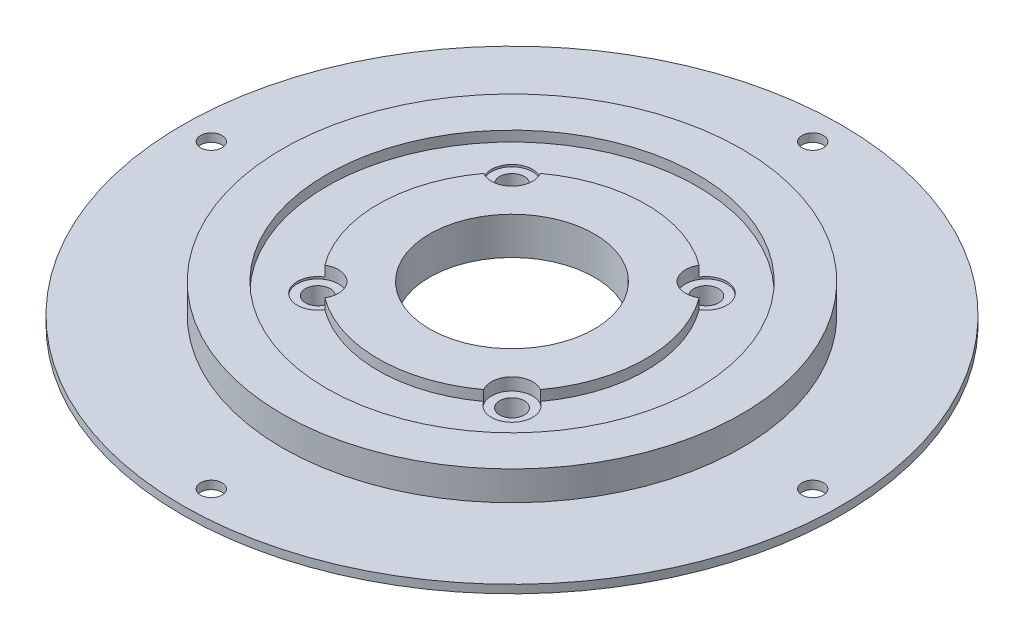
ISO-10303-21;
HEADER;
FILE_DESCRIPTION(('STEP AP214'),'2;1');
FILE_NAME('part.step','',(''),(''),'','','');
FILE_SCHEMA(('AUTOMOTIVE_DESIGN { 1 0 10303 214 1 1 1 1 }'));
ENDSEC;
DATA;
#1=APPLICATION_CONTEXT('core data for automotive mechanical design processes');
#2=APPLICATION_PROTOCOL_DEFINITION('international standard','automotive_design',2000,#1);
#3=PRODUCT_CONTEXT('',#1,'mechanical');
#4=PRODUCT('Part','Part','',(#3));
#5=PRODUCT_RELATED_PRODUCT_CATEGORY('part','',(#4));
#6=PRODUCT_DEFINITION_FORMATION('','',#4);
#7=PRODUCT_DEFINITION_CONTEXT('part definition',#1,'design');
#8=PRODUCT_DEFINITION('design','',#6,#7);
#9=PRODUCT_DEFINITION_SHAPE('','',#8);
#10=(LENGTH_UNIT() NAMED_UNIT(*) SI_UNIT(.MILLI.,.METRE.));
#11=(NAMED_UNIT(*) PLANE_ANGLE_UNIT() SI_UNIT($,.RADIAN.));
#12=(NAMED_UNIT(*) SI_UNIT($,.STERADIAN.) SOLID_ANGLE_UNIT());
#13=UNCERTAINTY_MEASURE_WITH_UNIT(LENGTH_MEASURE(1.E-05),#10,'distance_accuracy_value','');
#14=(GEOMETRIC_REPRESENTATION_CONTEXT(3) GLOBAL_UNCERTAINTY_ASSIGNED_CONTEXT((#13)) GLOBAL_UNIT_ASSIGNED_CONTEXT((#10,
#11,#12)) REPRESENTATION_CONTEXT('',''));
#15=CARTESIAN_POINT('',(0.,0.,0.));
#16=DIRECTION('',(0.,0.,1.));
#17=DIRECTION('',(1.,0.,0.));
#18=AXIS2_PLACEMENT_3D('',#15,#16,#17);
#19=CARTESIAN_POINT('',(-23.57,2.,23.57));
#20=DIRECTION('',(0.,-1.,0.));
#21=DIRECTION('',(0.,0.,-1.));
#22=AXIS2_PLACEMENT_3D('',#19,#20,#21);
#23=CYLINDRICAL_SURFACE('',#22,3.);
#24=CARTESIAN_POINT('',(-23.57,0.,23.57));
#25=DIRECTION('',(0.,-1.,0.));
#26=DIRECTION('',(0.,0.,-1.));
#27=AXIS2_PLACEMENT_3D('',#24,#25,#26);
#28=CIRCLE('',#27,3.);
#29=CARTESIAN_POINT('',(-23.57,0.,20.57));
#30=VERTEX_POINT('',#29);
#31=EDGE_CURVE('E389',#30,#30,#28,.T.);
#32=ORIENTED_EDGE('',*,*,#31,.T.);
#33=EDGE_LOOP('',(#32));
#34=FACE_BOUND('',#33,.T.);
#35=CARTESIAN_POINT('',(-23.57,6.1,23.57));
#36=DIRECTION('',(0.,1.,0.));
#37=DIRECTION('',(0.,0.,1.));
#38=AXIS2_PLACEMENT_3D('',#35,#36,#37);
#39=CIRCLE('',#38,3.);
#40=CARTESIAN_POINT('',(-23.57,6.1,26.57));
#41=VERTEX_POINT('',#40);
#42=EDGE_CURVE('E77',#41,#41,#39,.F.);
#43=ORIENTED_EDGE('',*,*,#42,.F.);
#44=EDGE_LOOP('',(#43));
#45=FACE_BOUND('',#44,.T.);
#46=ADVANCED_FACE('F73',(#34,#45),#23,.F.);
#47=CARTESIAN_POINT('',(23.57,2.,23.57));
#48=DIRECTION('',(0.,-1.,0.));
#49=DIRECTION('',(0.,0.,-1.));
#50=AXIS2_PLACEMENT_3D('',#47,#48,#49);
#51=CYLINDRICAL_SURFACE('',#50,3.);
#52=CARTESIAN_POINT('',(23.57,0.,23.57));
#53=DIRECTION('',(0.,-1.,0.));
#54=DIRECTION('',(0.,0.,-1.));
#55=AXIS2_PLACEMENT_3D('',#52,#53,#54);
#56=CIRCLE('',#55,3.);
#57=CARTESIAN_POINT('',(23.57,0.,20.57));
#58=VERTEX_POINT('',#57);
#59=EDGE_CURVE('E385',#58,#58,#56,.T.);
#60=ORIENTED_EDGE('',*,*,#59,.T.);
#61=EDGE_LOOP('',(#60));
#62=FACE_BOUND('',#61,.T.);
#63=CARTESIAN_POINT('',(23.57,6.1,23.57));
#64=DIRECTION('',(0.,1.,0.));
#65=DIRECTION('',(0.,0.,1.));
#66=AXIS2_PLACEMENT_3D('',#63,#64,#65);
#67=CIRCLE('',#66,3.);
#68=CARTESIAN_POINT('',(23.57,6.1,26.57));
#69=VERTEX_POINT('',#68);
#70=EDGE_CURVE('E211',#69,#69,#67,.F.);
#71=ORIENTED_EDGE('',*,*,#70,.F.);
#72=EDGE_LOOP('',(#71));
#73=FACE_BOUND('',#72,.T.);
#74=ADVANCED_FACE('F223',(#62,#73),#51,.F.);
#75=CARTESIAN_POINT('',(23.57,2.,-23.57));
#76=DIRECTION('',(0.,-1.,0.));
#77=DIRECTION('',(0.,0.,-1.));
#78=AXIS2_PLACEMENT_3D('',#75,#76,#77);
#79=CYLINDRICAL_SURFACE('',#78,3.);
#80=CARTESIAN_POINT('',(23.57,0.,-23.57));
#81=DIRECTION('',(0.,-1.,0.));
#82=DIRECTION('',(0.,0.,-1.));
#83=AXIS2_PLACEMENT_3D('',#80,#81,#82);
#84=CIRCLE('',#83,3.);
#85=CARTESIAN_POINT('',(23.57,0.,-26.57));
#86=VERTEX_POINT('',#85);
#87=EDGE_CURVE('E309',#86,#86,#84,.T.);
#88=ORIENTED_EDGE('',*,*,#87,.T.);
#89=EDGE_LOOP('',(#88));
#90=FACE_BOUND('',#89,.T.);
#91=CARTESIAN_POINT('',(23.57,6.1,-23.57));
#92=DIRECTION('',(0.,1.,0.));
#93=DIRECTION('',(0.,0.,1.));
#94=AXIS2_PLACEMENT_3D('',#91,#92,#93);
#95=CIRCLE('',#94,3.);
#96=CARTESIAN_POINT('',(23.57,6.1,-20.57));
#97=VERTEX_POINT('',#96);
#98=EDGE_CURVE('E207',#97,#97,#95,.F.);
#99=ORIENTED_EDGE('',*,*,#98,.F.);
#100=EDGE_LOOP('',(#99));
#101=FACE_BOUND('',#100,.T.);
#102=ADVANCED_FACE('F230',(#90,#101),#79,.F.);
#103=CARTESIAN_POINT('',(-23.57,2.,-23.57));
#104=DIRECTION('',(0.,-1.,0.));
#105=DIRECTION('',(0.,0.,-1.));
#106=AXIS2_PLACEMENT_3D('',#103,#104,#105);
#107=CYLINDRICAL_SURFACE('',#106,3.);
#108=CARTESIAN_POINT('',(-23.57,0.,-23.57));
#109=DIRECTION('',(0.,-1.,0.));
#110=DIRECTION('',(0.,0.,-1.));
#111=AXIS2_PLACEMENT_3D('',#108,#109,#110);
#112=CIRCLE('',#111,3.);
#113=CARTESIAN_POINT('',(-23.57,0.,-26.57));
#114=VERTEX_POINT('',#113);
#115=EDGE_CURVE('E184',#114,#114,#112,.T.);
#116=ORIENTED_EDGE('',*,*,#115,.T.);
#117=EDGE_LOOP('',(#116));
#118=FACE_BOUND('',#117,.T.);
#119=CARTESIAN_POINT('',(-23.57,6.1,-23.57));
#120=DIRECTION('',(0.,1.,0.));
#121=DIRECTION('',(0.,0.,1.));
#122=AXIS2_PLACEMENT_3D('',#119,#120,#121);
#123=CIRCLE('',#122,3.);
#124=CARTESIAN_POINT('',(-23.57,6.1,-20.57));
#125=VERTEX_POINT('',#124);
#126=EDGE_CURVE('E203',#125,#125,#123,.F.);
#127=ORIENTED_EDGE('',*,*,#126,.F.);
#128=EDGE_LOOP('',(#127));
#129=FACE_BOUND('',#128,.T.);
#130=ADVANCED_FACE('F236',(#118,#129),#107,.F.);
#131=CARTESIAN_POINT('',(0.,4.5,0.));
#132=DIRECTION('',(0.,-1.,0.));
#133=DIRECTION('',(0.,0.,-1.));
#134=AXIS2_PLACEMENT_3D('',#131,#132,#133);
#135=CYLINDRICAL_SURFACE('',#134,32.5);
#136=DIRECTION('',(0.,-1.,0.));
#137=VECTOR('',#136,1.);
#138=CARTESIAN_POINT('',(26.1557810098976,7.6,19.2905448280311));
#139=LINE('',#138,#137);
#140=CARTESIAN_POINT('',(26.1557810098976,6.6,19.2905448280311));
#141=VERTEX_POINT('',#140);
#142=CARTESIAN_POINT('',(26.1557810098976,9.1,19.2905448280311));
#143=VERTEX_POINT('',#142);
#144=EDGE_CURVE('E351',#141,#143,#139,.F.);
#145=ORIENTED_EDGE('',*,*,#144,.F.);
#146=CARTESIAN_POINT('',(0.,6.6,0.));
#147=DIRECTION('',(0.,1.,0.));
#148=DIRECTION('',(0.,0.,1.));
#149=AXIS2_PLACEMENT_3D('',#146,#147,#148);
#150=CIRCLE('',#149,32.5);
#151=CARTESIAN_POINT('',(26.1557810098954,6.6,-19.2905448280341));
#152=VERTEX_POINT('',#151);
#153=EDGE_CURVE('E188',#141,#152,#150,.T.);
#154=ORIENTED_EDGE('',*,*,#153,.T.);
#155=DIRECTION('',(0.,-1.,0.));
#156=VECTOR('',#155,1.);
#157=CARTESIAN_POINT('',(26.1557810098954,7.6,-19.2905448280341));
#158=LINE('',#157,#156);
#159=CARTESIAN_POINT('',(26.1557810098954,9.1,-19.2905448280341));
#160=VERTEX_POINT('',#159);
#161=EDGE_CURVE('E363',#160,#152,#158,.T.);
#162=ORIENTED_EDGE('',*,*,#161,.F.);
#163=CARTESIAN_POINT('',(0.,9.1,0.));
#164=DIRECTION('',(0.,1.,0.));
#165=DIRECTION('',(0.,0.,1.));
#166=AXIS2_PLACEMENT_3D('',#163,#164,#165);
#167=CIRCLE('',#166,32.5);
#168=EDGE_CURVE('E165',#143,#160,#167,.T.);
#169=ORIENTED_EDGE('',*,*,#168,.F.);
#170=EDGE_LOOP('',(#145,#154,#162,#169));
#171=FACE_BOUND('',#170,.T.);
#172=ADVANCED_FACE('F284',(#171),#135,.T.);
#173=DIRECTION('',(0.,-1.,0.));
#174=VECTOR('',#173,1.);
#175=CARTESIAN_POINT('',(19.2905448280326,7.6,-26.1557810098965));
#176=LINE('',#175,#174);
#177=CARTESIAN_POINT('',(19.2905448280326,6.6,-26.1557810098965));
#178=VERTEX_POINT('',#177);
#179=CARTESIAN_POINT('',(19.2905448280326,9.1,-26.1557810098965));
#180=VERTEX_POINT('',#179);
#181=EDGE_CURVE('E158',#178,#180,#176,.F.);
#182=ORIENTED_EDGE('',*,*,#181,.F.);
#183=CARTESIAN_POINT('',(0.,6.6,0.));
#184=DIRECTION('',(0.,1.,0.));
#185=DIRECTION('',(0.,0.,1.));
#186=AXIS2_PLACEMENT_3D('',#183,#184,#185);
#187=CIRCLE('',#186,32.5);
#188=CARTESIAN_POINT('',(-19.2905448280342,6.6,-26.1557810098954));
#189=VERTEX_POINT('',#188);
#190=EDGE_CURVE('E156',#178,#189,#187,.T.);
#191=ORIENTED_EDGE('',*,*,#190,.T.);
#192=DIRECTION('',(0.,-1.,0.));
#193=VECTOR('',#192,1.);
#194=CARTESIAN_POINT('',(-19.2905448280342,7.6,-26.1557810098953));
#195=LINE('',#194,#193);
#196=CARTESIAN_POINT('',(-19.2905448280342,9.1,-26.1557810098953));
#197=VERTEX_POINT('',#196);
#198=EDGE_CURVE('E140',#197,#189,#195,.T.);
#199=ORIENTED_EDGE('',*,*,#198,.F.);
#200=CARTESIAN_POINT('',(0.,9.1,0.));
#201=DIRECTION('',(0.,1.,0.));
#202=DIRECTION('',(0.,0.,1.));
#203=AXIS2_PLACEMENT_3D('',#200,#201,#202);
#204=CIRCLE('',#203,32.5);
#205=EDGE_CURVE('E154',#180,#197,#204,.T.);
#206=ORIENTED_EDGE('',*,*,#205,.F.);
#207=EDGE_LOOP('',(#182,#191,#199,#206));
#208=FACE_BOUND('',#207,.T.);
#209=ADVANCED_FACE('F153',(#208),#135,.T.);
#210=DIRECTION('',(0.,-1.,0.));
#211=VECTOR('',#210,1.);
#212=CARTESIAN_POINT('',(-26.1557810098955,7.6,19.290544828034));
#213=LINE('',#212,#211);
#214=CARTESIAN_POINT('',(-26.1557810098955,9.1,19.290544828034));
#215=VERTEX_POINT('',#214);
#216=CARTESIAN_POINT('',(-26.1557810098955,6.6,19.290544828034));
#217=VERTEX_POINT('',#216);
#218=EDGE_CURVE('E208',#215,#217,#213,.T.);
#219=ORIENTED_EDGE('',*,*,#218,.F.);
#220=CARTESIAN_POINT('',(0.,9.1,0.));
#221=DIRECTION('',(0.,1.,0.));
#222=DIRECTION('',(0.,0.,1.));
#223=AXIS2_PLACEMENT_3D('',#220,#221,#222);
#224=CIRCLE('',#223,32.5);
#225=CARTESIAN_POINT('',(-26.1557810098954,9.1,-19.2905448280342));
#226=VERTEX_POINT('',#225);
#227=EDGE_CURVE('E164',#226,#215,#224,.T.);
#228=ORIENTED_EDGE('',*,*,#227,.F.);
#229=DIRECTION('',(0.,-1.,0.));
#230=VECTOR('',#229,1.);
#231=CARTESIAN_POINT('',(-26.1557810098953,7.6,-19.2905448280342));
#232=LINE('',#231,#230);
#233=CARTESIAN_POINT('',(-26.1557810098954,6.6,-19.2905448280342));
#234=VERTEX_POINT('',#233);
#235=EDGE_CURVE('E99',#234,#226,#232,.F.);
#236=ORIENTED_EDGE('',*,*,#235,.F.);
#237=CARTESIAN_POINT('',(0.,6.6,0.));
#238=DIRECTION('',(0.,1.,0.));
#239=DIRECTION('',(0.,0.,1.));
#240=AXIS2_PLACEMENT_3D('',#237,#238,#239);
#241=CIRCLE('',#240,32.5);
#242=EDGE_CURVE('E187',#234,#217,#241,.T.);
#243=ORIENTED_EDGE('',*,*,#242,.T.);
#244=EDGE_LOOP('',(#219,#228,#236,#243));
#245=FACE_BOUND('',#244,.T.);
#246=ADVANCED_FACE('F281',(#245),#135,.T.);
#247=DIRECTION('',(0.,-1.,0.));
#248=VECTOR('',#247,1.);
#249=CARTESIAN_POINT('',(-19.2905448280326,7.6,26.1557810098966));
#250=LINE('',#249,#248);
#251=CARTESIAN_POINT('',(-19.2905448280326,6.6,26.1557810098966));
#252=VERTEX_POINT('',#251);
#253=CARTESIAN_POINT('',(-19.2905448280325,9.1,26.1557810098966));
#254=VERTEX_POINT('',#253);
#255=EDGE_CURVE('E91',#252,#254,#250,.F.);
#256=ORIENTED_EDGE('',*,*,#255,.F.);
#257=CARTESIAN_POINT('',(0.,6.6,0.));
#258=DIRECTION('',(0.,1.,0.));
#259=DIRECTION('',(0.,0.,1.));
#260=AXIS2_PLACEMENT_3D('',#257,#258,#259);
#261=CIRCLE('',#260,32.5);
#262=CARTESIAN_POINT('',(19.2905448280341,6.6,26.1557810098955));
#263=VERTEX_POINT('',#262);
#264=EDGE_CURVE('E192',#252,#263,#261,.T.);
#265=ORIENTED_EDGE('',*,*,#264,.T.);
#266=DIRECTION('',(0.,-1.,0.));
#267=VECTOR('',#266,1.);
#268=CARTESIAN_POINT('',(19.2905448280341,7.6,26.1557810098954));
#269=LINE('',#268,#267);
#270=CARTESIAN_POINT('',(19.2905448280341,9.1,26.1557810098954));
#271=VERTEX_POINT('',#270);
#272=EDGE_CURVE('E367',#271,#263,#269,.T.);
#273=ORIENTED_EDGE('',*,*,#272,.F.);
#274=CARTESIAN_POINT('',(0.,9.1,0.));
#275=DIRECTION('',(0.,1.,0.));
#276=DIRECTION('',(0.,0.,1.));
#277=AXIS2_PLACEMENT_3D('',#274,#275,#276);
#278=CIRCLE('',#277,32.5);
#279=EDGE_CURVE('E169',#254,#271,#278,.T.);
#280=ORIENTED_EDGE('',*,*,#279,.F.);
#281=EDGE_LOOP('',(#256,#265,#273,#280));
#282=FACE_BOUND('',#281,.T.);
#283=ADVANCED_FACE('F276',(#282),#135,.T.);
#284=CARTESIAN_POINT('',(0.,6.6,0.));
#285=DIRECTION('',(0.,1.,0.));
#286=DIRECTION('',(0.,0.,1.));
#287=AXIS2_PLACEMENT_3D('',#284,#285,#286);
#288=PLANE('',#287);
#289=ORIENTED_EDGE('',*,*,#264,.F.);
#290=CARTESIAN_POINT('',(-23.5699999999987,6.6,23.57));
#291=DIRECTION('',(0.,1.,0.));
#292=DIRECTION('',(0.,0.,1.));
#293=AXIS2_PLACEMENT_3D('',#290,#291,#292);
#294=CIRCLE('',#293,5.00000000000092);
#295=EDGE_CURVE('E377',#252,#217,#294,.F.);
#296=ORIENTED_EDGE('',*,*,#295,.T.);
#297=ORIENTED_EDGE('',*,*,#242,.F.);
#298=CARTESIAN_POINT('',(-23.57,6.6,-23.57));
#299=DIRECTION('',(0.,1.,0.));
#300=DIRECTION('',(0.,0.,1.));
#301=AXIS2_PLACEMENT_3D('',#298,#299,#300);
#302=CIRCLE('',#301,5.);
#303=EDGE_CURVE('E159',#234,#189,#302,.F.);
#304=ORIENTED_EDGE('',*,*,#303,.T.);
#305=ORIENTED_EDGE('',*,*,#190,.F.);
#306=CARTESIAN_POINT('',(23.57,6.6,-23.5700000000013));
#307=DIRECTION('',(0.,1.,0.));
#308=DIRECTION('',(0.,0.,1.));
#309=AXIS2_PLACEMENT_3D('',#306,#307,#308);
#310=CIRCLE('',#309,5.0000000000013);
#311=EDGE_CURVE('E360',#178,#152,#310,.F.);
#312=ORIENTED_EDGE('',*,*,#311,.T.);
#313=ORIENTED_EDGE('',*,*,#153,.F.);
#314=CARTESIAN_POINT('',(23.5700000000013,6.6,23.5699999999987));
#315=DIRECTION('',(0.,1.,0.));
#316=DIRECTION('',(0.,0.,1.));
#317=AXIS2_PLACEMENT_3D('',#314,#315,#316);
#318=CIRCLE('',#317,5.000000000002);
#319=EDGE_CURVE('E357',#141,#263,#318,.F.);
#320=ORIENTED_EDGE('',*,*,#319,.T.);
#321=EDGE_LOOP('',(#289,#296,#297,#304,#305,#312,#313,#320));
#322=FACE_BOUND('',#321,.T.);
#323=CARTESIAN_POINT('',(0.,6.6,0.));
#324=DIRECTION('',(0.,1.,0.));
#325=DIRECTION('',(0.,0.,1.));
#326=AXIS2_PLACEMENT_3D('',#323,#324,#325);
#327=CIRCLE('',#326,45.);
#328=CARTESIAN_POINT('',(0.,6.6,45.));
#329=VERTEX_POINT('',#328);
#330=EDGE_CURVE('E147',#329,#329,#327,.F.);
#331=ORIENTED_EDGE('',*,*,#330,.F.);
#332=EDGE_LOOP('',(#331));
#333=FACE_BOUND('',#332,.T.);
#334=ADVANCED_FACE('F264',(#322,#333),#288,.T.);
#335=CARTESIAN_POINT('',(0.,2.,0.));
#336=DIRECTION('',(0.,1.,0.));
#337=DIRECTION('',(0.,0.,1.));
#338=AXIS2_PLACEMENT_3D('',#335,#336,#337);
#339=PLANE('',#338);
#340=CARTESIAN_POINT('',(0.,2.,0.));
#341=DIRECTION('',(0.,1.,0.));
#342=DIRECTION('',(0.,0.,1.));
#343=AXIS2_PLACEMENT_3D('',#340,#341,#342);
#344=CIRCLE('',#343,55.75);
#345=CARTESIAN_POINT('',(0.,2.,55.75));
#346=VERTEX_POINT('',#345);
#347=EDGE_CURVE('E180',#346,#346,#344,.T.);
#348=ORIENTED_EDGE('',*,*,#347,.F.);
#349=EDGE_LOOP('',(#348));
#350=FACE_BOUND('',#349,.T.);
#351=CARTESIAN_POINT('',(0.,2.,-73.));
#352=DIRECTION('',(0.,1.,0.));
#353=DIRECTION('',(0.,0.,1.));
#354=AXIS2_PLACEMENT_3D('',#351,#352,#353);
#355=CIRCLE('',#354,2.60000000000001);
#356=CARTESIAN_POINT('',(0.,2.,-70.4));
#357=VERTEX_POINT('',#356);
#358=EDGE_CURVE('E403',#357,#357,#355,.T.);
#359=ORIENTED_EDGE('',*,*,#358,.F.);
#360=EDGE_LOOP('',(#359));
#361=FACE_BOUND('',#360,.T.);
#362=CARTESIAN_POINT('',(73.,2.,2.54878137735549E-13));
#363=DIRECTION('',(0.,1.,0.));
#364=DIRECTION('',(0.,0.,1.));
#365=AXIS2_PLACEMENT_3D('',#362,#363,#364);
#366=CIRCLE('',#365,2.60000000000001);
#367=CARTESIAN_POINT('',(73.,2.,2.60000000000026));
#368=VERTEX_POINT('',#367);
#369=EDGE_CURVE('E407',#368,#368,#366,.T.);
#370=ORIENTED_EDGE('',*,*,#369,.F.);
#371=EDGE_LOOP('',(#370));
#372=FACE_BOUND('',#371,.T.);
#373=CARTESIAN_POINT('',(-5.09756275471097E-13,2.,73.));
#374=DIRECTION('',(0.,1.,0.));
#375=DIRECTION('',(0.,0.,1.));
#376=AXIS2_PLACEMENT_3D('',#373,#374,#375);
#377=CIRCLE('',#376,2.60000000000001);
#378=CARTESIAN_POINT('',(-5.09756275471097E-13,2.,75.6));
#379=VERTEX_POINT('',#378);
#380=EDGE_CURVE('E415',#379,#379,#377,.T.);
#381=ORIENTED_EDGE('',*,*,#380,.F.);
#382=EDGE_LOOP('',(#381));
#383=FACE_BOUND('',#382,.T.);
#384=CARTESIAN_POINT('',(-73.,2.,-7.64634413206646E-13));
#385=DIRECTION('',(0.,1.,0.));
#386=DIRECTION('',(0.,0.,1.));
#387=AXIS2_PLACEMENT_3D('',#384,#385,#386);
#388=CIRCLE('',#387,2.60000000000001);
#389=CARTESIAN_POINT('',(-73.,2.,2.59999999999924));
#390=VERTEX_POINT('',#389);
#391=EDGE_CURVE('E423',#390,#390,#388,.T.);
#392=ORIENTED_EDGE('',*,*,#391,.F.);
#393=EDGE_LOOP('',(#392));
#394=FACE_BOUND('',#393,.T.);
#395=CARTESIAN_POINT('',(0.,2.,0.));
#396=DIRECTION('',(0.,1.,0.));
#397=DIRECTION('',(0.,0.,1.));
#398=AXIS2_PLACEMENT_3D('',#395,#396,#397);
#399=CIRCLE('',#398,80.);
#400=CARTESIAN_POINT('',(0.,2.,80.));
#401=VERTEX_POINT('',#400);
#402=EDGE_CURVE('E201',#401,#401,#399,.T.);
#403=ORIENTED_EDGE('',*,*,#402,.T.);
#404=EDGE_LOOP('',(#403));
#405=FACE_BOUND('',#404,.T.);
#406=ADVANCED_FACE('F260',(#350,#361,#372,#383,#394,#405),#339,.T.);
#407=CARTESIAN_POINT('',(0.,0.,0.));
#408=DIRECTION('',(0.,1.,0.));
#409=DIRECTION('',(0.,0.,1.));
#410=AXIS2_PLACEMENT_3D('',#407,#408,#409);
#411=PLANE('',#410);
#412=ORIENTED_EDGE('',*,*,#115,.F.);
#413=EDGE_LOOP('',(#412));
#414=FACE_BOUND('',#413,.T.);
#415=ORIENTED_EDGE('',*,*,#87,.F.);
#416=EDGE_LOOP('',(#415));
#417=FACE_BOUND('',#416,.T.);
#418=ORIENTED_EDGE('',*,*,#59,.F.);
#419=EDGE_LOOP('',(#418));
#420=FACE_BOUND('',#419,.T.);
#421=ORIENTED_EDGE('',*,*,#31,.F.);
#422=EDGE_LOOP('',(#421));
#423=FACE_BOUND('',#422,.T.);
#424=CARTESIAN_POINT('',(0.,0.,-73.));
#425=DIRECTION('',(0.,1.,0.));
#426=DIRECTION('',(0.,0.,1.));
#427=AXIS2_PLACEMENT_3D('',#424,#425,#426);
#428=CIRCLE('',#427,2.60000000000001);
#429=CARTESIAN_POINT('',(0.,0.,-70.4));
#430=VERTEX_POINT('',#429);
#431=EDGE_CURVE('E398',#430,#430,#428,.T.);
#432=ORIENTED_EDGE('',*,*,#431,.T.);
#433=EDGE_LOOP('',(#432));
#434=FACE_BOUND('',#433,.T.);
#435=CARTESIAN_POINT('',(73.,0.,2.54878137735549E-13));
#436=DIRECTION('',(0.,1.,0.));
#437=DIRECTION('',(0.,0.,1.));
#438=AXIS2_PLACEMENT_3D('',#435,#436,#437);
#439=CIRCLE('',#438,2.60000000000001);
#440=CARTESIAN_POINT('',(73.,0.,2.60000000000026));
#441=VERTEX_POINT('',#440);
#442=EDGE_CURVE('E411',#441,#441,#439,.T.);
#443=ORIENTED_EDGE('',*,*,#442,.T.);
#444=EDGE_LOOP('',(#443));
#445=FACE_BOUND('',#444,.T.);
#446=CARTESIAN_POINT('',(-5.09756275471097E-13,0.,73.));
#447=DIRECTION('',(0.,1.,0.));
#448=DIRECTION('',(0.,0.,1.));
#449=AXIS2_PLACEMENT_3D('',#446,#447,#448);
#450=CIRCLE('',#449,2.60000000000001);
#451=CARTESIAN_POINT('',(-5.09756275471097E-13,0.,75.6));
#452=VERTEX_POINT('',#451);
#453=EDGE_CURVE('E419',#452,#452,#450,.T.);
#454=ORIENTED_EDGE('',*,*,#453,.T.);
#455=EDGE_LOOP('',(#454));
#456=FACE_BOUND('',#455,.T.);
#457=CARTESIAN_POINT('',(-73.,0.,-7.64634413206646E-13));
#458=DIRECTION('',(0.,1.,0.));
#459=DIRECTION('',(0.,0.,1.));
#460=AXIS2_PLACEMENT_3D('',#457,#458,#459);
#461=CIRCLE('',#460,2.60000000000001);
#462=CARTESIAN_POINT('',(-73.,0.,2.59999999999924));
#463=VERTEX_POINT('',#462);
#464=EDGE_CURVE('E397',#463,#463,#461,.T.);
#465=ORIENTED_EDGE('',*,*,#464,.T.);
#466=EDGE_LOOP('',(#465));
#467=FACE_BOUND('',#466,.T.);
#468=CARTESIAN_POINT('',(0.,0.,0.));
#469=DIRECTION('',(0.,1.,0.));
#470=DIRECTION('',(0.,0.,1.));
#471=AXIS2_PLACEMENT_3D('',#468,#469,#470);
#472=CIRCLE('',#471,80.);
#473=CARTESIAN_POINT('',(0.,0.,80.));
#474=VERTEX_POINT('',#473);
#475=EDGE_CURVE('E433',#474,#474,#472,.T.);
#476=ORIENTED_EDGE('',*,*,#475,.F.);
#477=EDGE_LOOP('',(#476));
#478=FACE_BOUND('',#477,.T.);
#479=CARTESIAN_POINT('',(0.,0.,0.));
#480=DIRECTION('',(0.,1.,0.));
#481=DIRECTION('',(0.,0.,1.));
#482=AXIS2_PLACEMENT_3D('',#479,#480,#481);
#483=CIRCLE('',#482,20.);
#484=CARTESIAN_POINT('',(0.,0.,20.));
#485=VERTEX_POINT('',#484);
#486=EDGE_CURVE('E402',#485,#485,#483,.T.);
#487=ORIENTED_EDGE('',*,*,#486,.T.);
#488=EDGE_LOOP('',(#487));
#489=FACE_BOUND('',#488,.T.);
#490=ADVANCED_FACE('F263',(#414,#417,#420,#423,#434,#445,#456,#467,#478,#489),#411,.F.);
#491=CARTESIAN_POINT('',(0.,2.,0.));
#492=DIRECTION('',(0.,-1.,0.));
#493=DIRECTION('',(0.,0.,-1.));
#494=AXIS2_PLACEMENT_3D('',#491,#492,#493);
#495=CYLINDRICAL_SURFACE('',#494,80.);
#496=ORIENTED_EDGE('',*,*,#402,.F.);
#497=EDGE_LOOP('',(#496));
#498=FACE_BOUND('',#497,.T.);
#499=ORIENTED_EDGE('',*,*,#475,.T.);
#500=EDGE_LOOP('',(#499));
#501=FACE_BOUND('',#500,.T.);
#502=ADVANCED_FACE('F258',(#498,#501),#495,.T.);
#503=CARTESIAN_POINT('',(0.,2.,0.));
#504=DIRECTION('',(0.,-1.,0.));
#505=DIRECTION('',(0.,0.,-1.));
#506=AXIS2_PLACEMENT_3D('',#503,#504,#505);
#507=CYLINDRICAL_SURFACE('',#506,20.);
#508=ORIENTED_EDGE('',*,*,#486,.F.);
#509=EDGE_LOOP('',(#508));
#510=FACE_BOUND('',#509,.T.);
#511=CARTESIAN_POINT('',(0.,9.1,0.));
#512=DIRECTION('',(0.,1.,0.));
#513=DIRECTION('',(0.,0.,1.));
#514=AXIS2_PLACEMENT_3D('',#511,#512,#513);
#515=CIRCLE('',#514,20.);
#516=CARTESIAN_POINT('',(0.,9.1,20.));
#517=VERTEX_POINT('',#516);
#518=EDGE_CURVE('E171',#517,#517,#515,.F.);
#519=ORIENTED_EDGE('',*,*,#518,.F.);
#520=EDGE_LOOP('',(#519));
#521=FACE_BOUND('',#520,.T.);
#522=ADVANCED_FACE('F254',(#510,#521),#507,.F.);
#523=CARTESIAN_POINT('',(-73.,0.,-7.64634413206646E-13));
#524=DIRECTION('',(0.,1.,0.));
#525=DIRECTION('',(0.,0.,1.));
#526=AXIS2_PLACEMENT_3D('',#523,#524,#525);
#527=CYLINDRICAL_SURFACE('',#526,2.60000000000001);
#528=ORIENTED_EDGE('',*,*,#464,.F.);
#529=EDGE_LOOP('',(#528));
#530=FACE_BOUND('',#529,.T.);
#531=ORIENTED_EDGE('',*,*,#391,.T.);
#532=EDGE_LOOP('',(#531));
#533=FACE_BOUND('',#532,.T.);
#534=ADVANCED_FACE('F250',(#530,#533),#527,.F.);
#535=CARTESIAN_POINT('',(-5.09756275471097E-13,0.,73.));
#536=DIRECTION('',(0.,1.,0.));
#537=DIRECTION('',(0.,0.,1.));
#538=AXIS2_PLACEMENT_3D('',#535,#536,#537);
#539=CYLINDRICAL_SURFACE('',#538,2.60000000000001);
#540=ORIENTED_EDGE('',*,*,#453,.F.);
#541=EDGE_LOOP('',(#540));
#542=FACE_BOUND('',#541,.T.);
#543=ORIENTED_EDGE('',*,*,#380,.T.);
#544=EDGE_LOOP('',(#543));
#545=FACE_BOUND('',#544,.T.);
#546=ADVANCED_FACE('F246',(#542,#545),#539,.F.);
#547=CARTESIAN_POINT('',(73.,0.,2.54878137735549E-13));
#548=DIRECTION('',(0.,1.,0.));
#549=DIRECTION('',(0.,0.,1.));
#550=AXIS2_PLACEMENT_3D('',#547,#548,#549);
#551=CYLINDRICAL_SURFACE('',#550,2.60000000000001);
#552=ORIENTED_EDGE('',*,*,#442,.F.);
#553=EDGE_LOOP('',(#552));
#554=FACE_BOUND('',#553,.T.);
#555=ORIENTED_EDGE('',*,*,#369,.T.);
#556=EDGE_LOOP('',(#555));
#557=FACE_BOUND('',#556,.T.);
#558=ADVANCED_FACE('F242',(#554,#557),#551,.F.);
#559=CARTESIAN_POINT('',(0.,0.,-73.));
#560=DIRECTION('',(0.,1.,0.));
#561=DIRECTION('',(0.,0.,1.));
#562=AXIS2_PLACEMENT_3D('',#559,#560,#561);
#563=CYLINDRICAL_SURFACE('',#562,2.60000000000001);
#564=ORIENTED_EDGE('',*,*,#431,.F.);
#565=EDGE_LOOP('',(#564));
#566=FACE_BOUND('',#565,.T.);
#567=ORIENTED_EDGE('',*,*,#358,.T.);
#568=EDGE_LOOP('',(#567));
#569=FACE_BOUND('',#568,.T.);
#570=ADVANCED_FACE('F238',(#566,#569),#563,.F.);
#571=CARTESIAN_POINT('',(0.,4.5,0.));
#572=DIRECTION('',(0.,-1.,0.));
#573=DIRECTION('',(0.,0.,-1.));
#574=AXIS2_PLACEMENT_3D('',#571,#572,#573);
#575=CYLINDRICAL_SURFACE('',#574,45.);
#576=CARTESIAN_POINT('',(0.,9.1,0.));
#577=DIRECTION('',(0.,1.,0.));
#578=DIRECTION('',(0.,0.,1.));
#579=AXIS2_PLACEMENT_3D('',#576,#577,#578);
#580=CIRCLE('',#579,45.);
#581=CARTESIAN_POINT('',(0.,9.1,45.));
#582=VERTEX_POINT('',#581);
#583=EDGE_CURVE('E175',#582,#582,#580,.T.);
#584=ORIENTED_EDGE('',*,*,#583,.T.);
#585=EDGE_LOOP('',(#584));
#586=FACE_BOUND('',#585,.T.);
#587=ORIENTED_EDGE('',*,*,#330,.T.);
#588=EDGE_LOOP('',(#587));
#589=FACE_BOUND('',#588,.T.);
#590=ADVANCED_FACE('F241',(#586,#589),#575,.F.);
#591=CARTESIAN_POINT('',(0.,4.5,0.));
#592=DIRECTION('',(0.,-1.,0.));
#593=DIRECTION('',(0.,0.,-1.));
#594=AXIS2_PLACEMENT_3D('',#591,#592,#593);
#595=CYLINDRICAL_SURFACE('',#594,55.75);
#596=CARTESIAN_POINT('',(0.,9.1,0.));
#597=DIRECTION('',(0.,1.,0.));
#598=DIRECTION('',(0.,0.,1.));
#599=AXIS2_PLACEMENT_3D('',#596,#597,#598);
#600=CIRCLE('',#599,55.75);
#601=CARTESIAN_POINT('',(0.,9.1,55.75));
#602=VERTEX_POINT('',#601);
#603=EDGE_CURVE('E179',#602,#602,#600,.T.);
#604=ORIENTED_EDGE('',*,*,#603,.F.);
#605=EDGE_LOOP('',(#604));
#606=FACE_BOUND('',#605,.T.);
#607=ORIENTED_EDGE('',*,*,#347,.T.);
#608=EDGE_LOOP('',(#607));
#609=FACE_BOUND('',#608,.T.);
#610=ADVANCED_FACE('F292',(#606,#609),#595,.T.);
#611=CARTESIAN_POINT('',(0.,9.1,0.));
#612=DIRECTION('',(0.,1.,0.));
#613=DIRECTION('',(0.,0.,1.));
#614=AXIS2_PLACEMENT_3D('',#611,#612,#613);
#615=PLANE('',#614);
#616=ORIENTED_EDGE('',*,*,#583,.F.);
#617=EDGE_LOOP('',(#616));
#618=FACE_BOUND('',#617,.T.);
#619=ORIENTED_EDGE('',*,*,#603,.T.);
#620=EDGE_LOOP('',(#619));
#621=FACE_BOUND('',#620,.T.);
#622=ADVANCED_FACE('F75',(#618,#621),#615,.T.);
#623=CARTESIAN_POINT('',(0.,9.1,0.));
#624=DIRECTION('',(0.,1.,0.));
#625=DIRECTION('',(0.,0.,1.));
#626=AXIS2_PLACEMENT_3D('',#623,#624,#625);
#627=PLANE('',#626);
#628=ORIENTED_EDGE('',*,*,#518,.T.);
#629=EDGE_LOOP('',(#628));
#630=FACE_BOUND('',#629,.T.);
#631=ORIENTED_EDGE('',*,*,#227,.T.);
#632=CARTESIAN_POINT('',(-23.5699999999987,9.1,23.57));
#633=DIRECTION('',(0.,1.,0.));
#634=DIRECTION('',(0.,0.,1.));
#635=AXIS2_PLACEMENT_3D('',#632,#633,#634);
#636=CIRCLE('',#635,5.00000000000092);
#637=EDGE_CURVE('E446',#254,#215,#636,.T.);
#638=ORIENTED_EDGE('',*,*,#637,.F.);
#639=ORIENTED_EDGE('',*,*,#279,.T.);
#640=CARTESIAN_POINT('',(23.5700000000013,9.1,23.5699999999987));
#641=DIRECTION('',(0.,1.,0.));
#642=DIRECTION('',(0.,0.,1.));
#643=AXIS2_PLACEMENT_3D('',#640,#641,#642);
#644=CIRCLE('',#643,5.000000000002);
#645=EDGE_CURVE('E445',#143,#271,#644,.T.);
#646=ORIENTED_EDGE('',*,*,#645,.F.);
#647=ORIENTED_EDGE('',*,*,#168,.T.);
#648=CARTESIAN_POINT('',(23.57,9.1,-23.5700000000013));
#649=DIRECTION('',(0.,1.,0.));
#650=DIRECTION('',(0.,0.,1.));
#651=AXIS2_PLACEMENT_3D('',#648,#649,#650);
#652=CIRCLE('',#651,5.0000000000013);
#653=EDGE_CURVE('E13',#160,#180,#652,.F.);
#654=ORIENTED_EDGE('',*,*,#653,.T.);
#655=ORIENTED_EDGE('',*,*,#205,.T.);
#656=CARTESIAN_POINT('',(-23.57,9.1,-23.57));
#657=DIRECTION('',(0.,1.,0.));
#658=DIRECTION('',(0.,0.,1.));
#659=AXIS2_PLACEMENT_3D('',#656,#657,#658);
#660=CIRCLE('',#659,5.);
#661=EDGE_CURVE('E83',#197,#226,#660,.F.);
#662=ORIENTED_EDGE('',*,*,#661,.T.);
#663=EDGE_LOOP('',(#631,#638,#639,#646,#647,#654,#655,#662));
#664=FACE_BOUND('',#663,.T.);
#665=ADVANCED_FACE('F161',(#630,#664),#627,.T.);
#666=CARTESIAN_POINT('',(-23.57,6.1,-23.57));
#667=DIRECTION('',(0.,1.,0.));
#668=DIRECTION('',(0.,0.,1.));
#669=AXIS2_PLACEMENT_3D('',#666,#667,#668);
#670=PLANE('',#669);
#671=CARTESIAN_POINT('',(-23.57,6.1,-23.57));
#672=DIRECTION('',(0.,1.,0.));
#673=DIRECTION('',(0.,0.,1.));
#674=AXIS2_PLACEMENT_3D('',#671,#672,#673);
#675=CIRCLE('',#674,5.);
#676=CARTESIAN_POINT('',(-23.57,6.1,-18.57));
#677=VERTEX_POINT('',#676);
#678=EDGE_CURVE('E463',#677,#677,#675,.T.);
#679=ORIENTED_EDGE('',*,*,#678,.T.);
#680=EDGE_LOOP('',(#679));
#681=FACE_BOUND('',#680,.T.);
#682=ORIENTED_EDGE('',*,*,#126,.T.);
#683=EDGE_LOOP('',(#682));
#684=FACE_BOUND('',#683,.T.);
#685=ADVANCED_FACE('F273',(#681,#684),#670,.T.);
#686=CARTESIAN_POINT('',(-23.57,9.1,-23.57));
#687=DIRECTION('',(0.,-1.,0.));
#688=DIRECTION('',(0.,0.,-1.));
#689=AXIS2_PLACEMENT_3D('',#686,#687,#688);
#690=CYLINDRICAL_SURFACE('',#689,5.);
#691=ORIENTED_EDGE('',*,*,#678,.F.);
#692=EDGE_LOOP('',(#691));
#693=FACE_BOUND('',#692,.T.);
#694=ORIENTED_EDGE('',*,*,#198,.T.);
#695=ORIENTED_EDGE('',*,*,#303,.F.);
#696=ORIENTED_EDGE('',*,*,#235,.T.);
#697=ORIENTED_EDGE('',*,*,#661,.F.);
#698=EDGE_LOOP('',(#694,#695,#696,#697));
#699=FACE_BOUND('',#698,.T.);
#700=ADVANCED_FACE('F139',(#693,#699),#690,.F.);
#701=CARTESIAN_POINT('',(23.57,6.1,-23.5700000000013));
#702=DIRECTION('',(0.,1.,0.));
#703=DIRECTION('',(0.,0.,1.));
#704=AXIS2_PLACEMENT_3D('',#701,#702,#703);
#705=PLANE('',#704);
#706=CARTESIAN_POINT('',(23.57,6.1,-23.5700000000013));
#707=DIRECTION('',(0.,1.,0.));
#708=DIRECTION('',(0.,0.,1.));
#709=AXIS2_PLACEMENT_3D('',#706,#707,#708);
#710=CIRCLE('',#709,5.0000000000013);
#711=CARTESIAN_POINT('',(23.57,6.1,-18.57));
#712=VERTEX_POINT('',#711);
#713=EDGE_CURVE('E455',#712,#712,#710,.T.);
#714=ORIENTED_EDGE('',*,*,#713,.T.);
#715=EDGE_LOOP('',(#714));
#716=FACE_BOUND('',#715,.T.);
#717=ORIENTED_EDGE('',*,*,#98,.T.);
#718=EDGE_LOOP('',(#717));
#719=FACE_BOUND('',#718,.T.);
#720=ADVANCED_FACE('F312',(#716,#719),#705,.T.);
#721=CARTESIAN_POINT('',(23.57,9.1,-23.5700000000013));
#722=DIRECTION('',(0.,-1.,0.));
#723=DIRECTION('',(0.,0.,-1.));
#724=AXIS2_PLACEMENT_3D('',#721,#722,#723);
#725=CYLINDRICAL_SURFACE('',#724,5.0000000000013);
#726=ORIENTED_EDGE('',*,*,#713,.F.);
#727=EDGE_LOOP('',(#726));
#728=FACE_BOUND('',#727,.T.);
#729=ORIENTED_EDGE('',*,*,#161,.T.);
#730=ORIENTED_EDGE('',*,*,#311,.F.);
#731=ORIENTED_EDGE('',*,*,#181,.T.);
#732=ORIENTED_EDGE('',*,*,#653,.F.);
#733=EDGE_LOOP('',(#729,#730,#731,#732));
#734=FACE_BOUND('',#733,.T.);
#735=ADVANCED_FACE('F314',(#728,#734),#725,.F.);
#736=CARTESIAN_POINT('',(23.5700000000013,6.1,23.5699999999987));
#737=DIRECTION('',(0.,1.,0.));
#738=DIRECTION('',(0.,0.,1.));
#739=AXIS2_PLACEMENT_3D('',#736,#737,#738);
#740=PLANE('',#739);
#741=CARTESIAN_POINT('',(23.5700000000013,6.1,23.5699999999987));
#742=DIRECTION('',(0.,1.,0.));
#743=DIRECTION('',(0.,0.,1.));
#744=AXIS2_PLACEMENT_3D('',#741,#742,#743);
#745=CIRCLE('',#744,5.000000000002);
#746=CARTESIAN_POINT('',(23.5700000000013,6.1,28.5700000000007));
#747=VERTEX_POINT('',#746);
#748=EDGE_CURVE('E449',#747,#747,#745,.T.);
#749=ORIENTED_EDGE('',*,*,#748,.T.);
#750=EDGE_LOOP('',(#749));
#751=FACE_BOUND('',#750,.T.);
#752=ORIENTED_EDGE('',*,*,#70,.T.);
#753=EDGE_LOOP('',(#752));
#754=FACE_BOUND('',#753,.T.);
#755=ADVANCED_FACE('F321',(#751,#754),#740,.T.);
#756=CARTESIAN_POINT('',(23.5700000000013,9.1,23.5699999999987));
#757=DIRECTION('',(0.,-1.,0.));
#758=DIRECTION('',(0.,0.,-1.));
#759=AXIS2_PLACEMENT_3D('',#756,#757,#758);
#760=CYLINDRICAL_SURFACE('',#759,5.000000000002);
#761=ORIENTED_EDGE('',*,*,#748,.F.);
#762=EDGE_LOOP('',(#761));
#763=FACE_BOUND('',#762,.T.);
#764=ORIENTED_EDGE('',*,*,#144,.T.);
#765=ORIENTED_EDGE('',*,*,#645,.T.);
#766=ORIENTED_EDGE('',*,*,#272,.T.);
#767=ORIENTED_EDGE('',*,*,#319,.F.);
#768=EDGE_LOOP('',(#764,#765,#766,#767));
#769=FACE_BOUND('',#768,.T.);
#770=ADVANCED_FACE('F328',(#763,#769),#760,.F.);
#771=CARTESIAN_POINT('',(-23.5699999999987,6.1,23.57));
#772=DIRECTION('',(0.,1.,0.));
#773=DIRECTION('',(0.,0.,1.));
#774=AXIS2_PLACEMENT_3D('',#771,#772,#773);
#775=PLANE('',#774);
#776=CARTESIAN_POINT('',(-23.5699999999987,6.1,23.57));
#777=DIRECTION('',(0.,1.,0.));
#778=DIRECTION('',(0.,0.,1.));
#779=AXIS2_PLACEMENT_3D('',#776,#777,#778);
#780=CIRCLE('',#779,5.00000000000092);
#781=CARTESIAN_POINT('',(-23.5699999999987,6.1,28.5700000000009));
#782=VERTEX_POINT('',#781);
#783=EDGE_CURVE('E450',#782,#782,#780,.T.);
#784=ORIENTED_EDGE('',*,*,#783,.T.);
#785=EDGE_LOOP('',(#784));
#786=FACE_BOUND('',#785,.T.);
#787=ORIENTED_EDGE('',*,*,#42,.T.);
#788=EDGE_LOOP('',(#787));
#789=FACE_BOUND('',#788,.T.);
#790=ADVANCED_FACE('F220',(#786,#789),#775,.T.);
#791=CARTESIAN_POINT('',(-23.5699999999987,9.1,23.57));
#792=DIRECTION('',(0.,-1.,0.));
#793=DIRECTION('',(0.,0.,-1.));
#794=AXIS2_PLACEMENT_3D('',#791,#792,#793);
#795=CYLINDRICAL_SURFACE('',#794,5.00000000000092);
#796=ORIENTED_EDGE('',*,*,#783,.F.);
#797=EDGE_LOOP('',(#796));
#798=FACE_BOUND('',#797,.T.);
#799=ORIENTED_EDGE('',*,*,#218,.T.);
#800=ORIENTED_EDGE('',*,*,#295,.F.);
#801=ORIENTED_EDGE('',*,*,#255,.T.);
#802=ORIENTED_EDGE('',*,*,#637,.T.);
#803=EDGE_LOOP('',(#799,#800,#801,#802));
#804=FACE_BOUND('',#803,.T.);
#805=ADVANCED_FACE('F335',(#798,#804),#795,.F.);
#806=CLOSED_SHELL('',(#46,#74,#102,#130,#172,#209,#246,#283,#334,#406,#490,#502,#522,#534,#546,
#558,#570,#590,#610,#622,#665,#685,#700,#720,#735,#755,#770,#790,#805));
#807=MANIFOLD_SOLID_BREP('B2',#806);
#808=ADVANCED_BREP_SHAPE_REPRESENTATION('',(#18,#807),#14);
#809=SHAPE_DEFINITION_REPRESENTATION(#9,#808);
ENDSEC;
END-ISO-10303-21;
